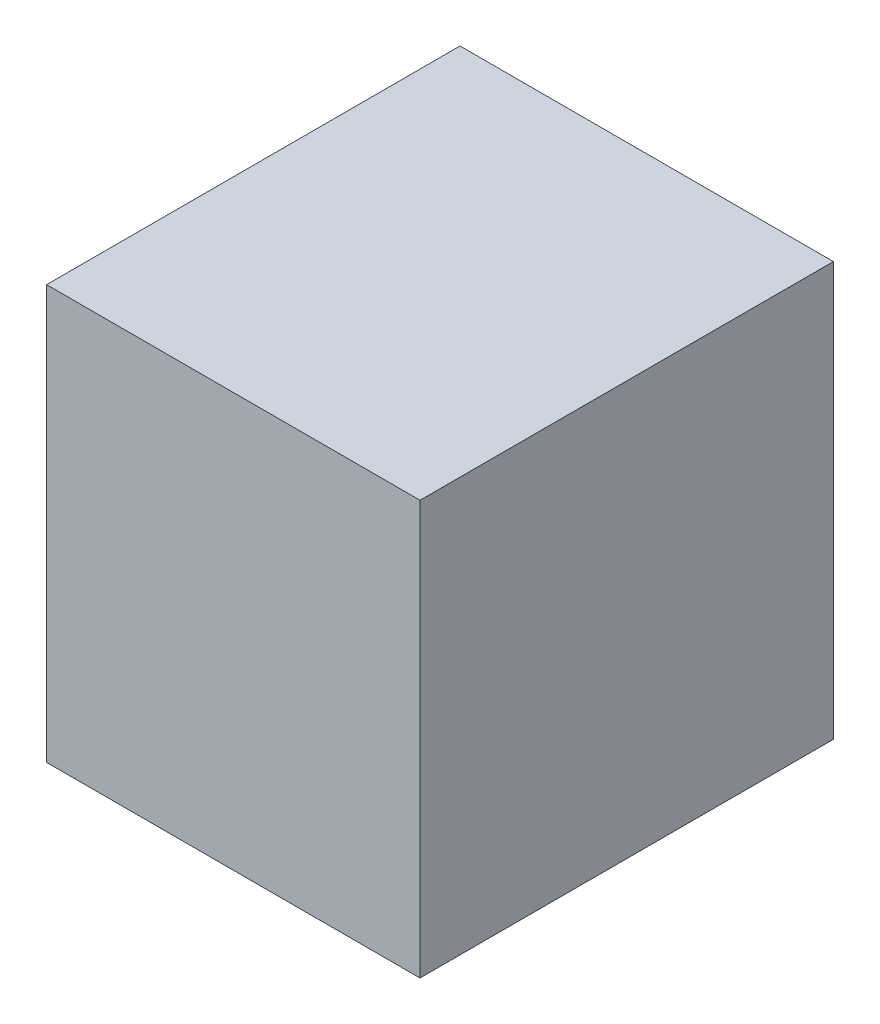
ISO-10303-21;
HEADER;
FILE_DESCRIPTION(('STEP AP214'),'2;1');
FILE_NAME('part.step','',(''),(''),'','','');
FILE_SCHEMA(('AUTOMOTIVE_DESIGN { 1 0 10303 214 1 1 1 1 }'));
ENDSEC;
DATA;
#1=APPLICATION_CONTEXT('core data for automotive mechanical design processes');
#2=APPLICATION_PROTOCOL_DEFINITION('international standard','automotive_design',2000,#1);
#3=PRODUCT_CONTEXT('',#1,'mechanical');
#4=PRODUCT('Part','Part','',(#3));
#5=PRODUCT_RELATED_PRODUCT_CATEGORY('part','',(#4));
#6=PRODUCT_DEFINITION_FORMATION('','',#4);
#7=PRODUCT_DEFINITION_CONTEXT('part definition',#1,'design');
#8=PRODUCT_DEFINITION('design','',#6,#7);
#9=PRODUCT_DEFINITION_SHAPE('','',#8);
#10=(LENGTH_UNIT() NAMED_UNIT(*) SI_UNIT(.MILLI.,.METRE.));
#11=(NAMED_UNIT(*) PLANE_ANGLE_UNIT() SI_UNIT($,.RADIAN.));
#12=(NAMED_UNIT(*) SI_UNIT($,.STERADIAN.) SOLID_ANGLE_UNIT());
#13=UNCERTAINTY_MEASURE_WITH_UNIT(LENGTH_MEASURE(1.E-05),#10,'distance_accuracy_value','');
#14=(GEOMETRIC_REPRESENTATION_CONTEXT(3) GLOBAL_UNCERTAINTY_ASSIGNED_CONTEXT((#13)) GLOBAL_UNIT_ASSIGNED_CONTEXT((#10,
#11,#12)) REPRESENTATION_CONTEXT('',''));
#15=CARTESIAN_POINT('',(0.,0.,0.));
#16=DIRECTION('',(0.,0.,1.));
#17=DIRECTION('',(1.,0.,0.));
#18=AXIS2_PLACEMENT_3D('',#15,#16,#17);
#19=CARTESIAN_POINT('',(0.546,-0.605,0.018));
#20=DIRECTION('',(1.,0.,0.));
#21=DIRECTION('',(0.,0.,-1.));
#22=AXIS2_PLACEMENT_3D('',#19,#20,#21);
#23=PLANE('',#22);
#24=DIRECTION('',(0.,1.,0.));
#25=VECTOR('',#24,1.);
#26=CARTESIAN_POINT('',(0.546,-0.605,1.227));
#27=LINE('',#26,#25);
#28=CARTESIAN_POINT('',(0.546,-0.605,1.227));
#29=VERTEX_POINT('',#28);
#30=CARTESIAN_POINT('',(0.546,0.605,1.227));
#31=VERTEX_POINT('',#30);
#32=EDGE_CURVE('E68',#29,#31,#27,.T.);
#33=ORIENTED_EDGE('',*,*,#32,.F.);
#34=DIRECTION('',(0.,0.,-1.));
#35=VECTOR('',#34,1.);
#36=CARTESIAN_POINT('',(0.546,-0.605,0.018));
#37=LINE('',#36,#35);
#38=CARTESIAN_POINT('',(0.546,-0.605,0.018));
#39=VERTEX_POINT('',#38);
#40=EDGE_CURVE('E55',#39,#29,#37,.F.);
#41=ORIENTED_EDGE('',*,*,#40,.F.);
#42=DIRECTION('',(0.,1.,0.));
#43=VECTOR('',#42,1.);
#44=CARTESIAN_POINT('',(0.546,0.605,0.018));
#45=LINE('',#44,#43);
#46=CARTESIAN_POINT('',(0.546,0.605,0.018));
#47=VERTEX_POINT('',#46);
#48=EDGE_CURVE('E20',#47,#39,#45,.F.);
#49=ORIENTED_EDGE('',*,*,#48,.F.);
#50=DIRECTION('',(0.,0.,1.));
#51=VECTOR('',#50,1.);
#52=CARTESIAN_POINT('',(0.546,0.605,0.018));
#53=LINE('',#52,#51);
#54=EDGE_CURVE('E81',#31,#47,#53,.F.);
#55=ORIENTED_EDGE('',*,*,#54,.F.);
#56=EDGE_LOOP('',(#33,#41,#49,#55));
#57=FACE_BOUND('',#56,.T.);
#58=ADVANCED_FACE('F17',(#57),#23,.T.);
#59=CARTESIAN_POINT('',(-0.546,0.605,0.018));
#60=DIRECTION('',(0.,0.,-1.));
#61=DIRECTION('',(-1.,0.,0.));
#62=AXIS2_PLACEMENT_3D('',#59,#60,#61);
#63=PLANE('',#62);
#64=DIRECTION('',(1.,0.,0.));
#65=VECTOR('',#64,1.);
#66=CARTESIAN_POINT('',(-0.546,-0.605,0.018));
#67=LINE('',#66,#65);
#68=CARTESIAN_POINT('',(-0.546,-0.605,0.018));
#69=VERTEX_POINT('',#68);
#70=EDGE_CURVE('E61',#69,#39,#67,.T.);
#71=ORIENTED_EDGE('',*,*,#70,.F.);
#72=DIRECTION('',(0.,1.,0.));
#73=VECTOR('',#72,1.);
#74=CARTESIAN_POINT('',(-0.546,0.605,0.018));
#75=LINE('',#74,#73);
#76=CARTESIAN_POINT('',(-0.546,0.605,0.018));
#77=VERTEX_POINT('',#76);
#78=EDGE_CURVE('E83',#77,#69,#75,.F.);
#79=ORIENTED_EDGE('',*,*,#78,.F.);
#80=DIRECTION('',(1.,0.,0.));
#81=VECTOR('',#80,1.);
#82=CARTESIAN_POINT('',(0.546,0.605,0.018));
#83=LINE('',#82,#81);
#84=EDGE_CURVE('E64',#47,#77,#83,.F.);
#85=ORIENTED_EDGE('',*,*,#84,.F.);
#86=ORIENTED_EDGE('',*,*,#48,.T.);
#87=EDGE_LOOP('',(#71,#79,#85,#86));
#88=FACE_BOUND('',#87,.T.);
#89=ADVANCED_FACE('F60',(#88),#63,.T.);
#90=CARTESIAN_POINT('',(-0.546,-0.605,0.018));
#91=DIRECTION('',(0.,-1.,0.));
#92=DIRECTION('',(0.,0.,-1.));
#93=AXIS2_PLACEMENT_3D('',#90,#91,#92);
#94=PLANE('',#93);
#95=DIRECTION('',(1.,0.,0.));
#96=VECTOR('',#95,1.);
#97=CARTESIAN_POINT('',(-0.546,-0.605,1.227));
#98=LINE('',#97,#96);
#99=CARTESIAN_POINT('',(-0.546,-0.605,1.227));
#100=VERTEX_POINT('',#99);
#101=EDGE_CURVE('E70',#100,#29,#98,.T.);
#102=ORIENTED_EDGE('',*,*,#101,.F.);
#103=DIRECTION('',(0.,0.,1.));
#104=VECTOR('',#103,1.);
#105=CARTESIAN_POINT('',(-0.546,-0.605,0.018));
#106=LINE('',#105,#104);
#107=EDGE_CURVE('E74',#69,#100,#106,.T.);
#108=ORIENTED_EDGE('',*,*,#107,.F.);
#109=ORIENTED_EDGE('',*,*,#70,.T.);
#110=ORIENTED_EDGE('',*,*,#40,.T.);
#111=EDGE_LOOP('',(#102,#108,#109,#110));
#112=FACE_BOUND('',#111,.T.);
#113=ADVANCED_FACE('F72',(#112),#94,.T.);
#114=CARTESIAN_POINT('',(-0.546,-0.605,1.227));
#115=DIRECTION('',(0.,0.,1.));
#116=DIRECTION('',(1.,0.,0.));
#117=AXIS2_PLACEMENT_3D('',#114,#115,#116);
#118=PLANE('',#117);
#119=DIRECTION('',(1.,0.,0.));
#120=VECTOR('',#119,1.);
#121=CARTESIAN_POINT('',(0.546,0.605,1.227));
#122=LINE('',#121,#120);
#123=CARTESIAN_POINT('',(-0.546,0.605,1.227));
#124=VERTEX_POINT('',#123);
#125=EDGE_CURVE('E35',#124,#31,#122,.T.);
#126=ORIENTED_EDGE('',*,*,#125,.F.);
#127=DIRECTION('',(0.,1.,0.));
#128=VECTOR('',#127,1.);
#129=CARTESIAN_POINT('',(-0.546,0.605,1.227));
#130=LINE('',#129,#128);
#131=EDGE_CURVE('E26',#100,#124,#130,.T.);
#132=ORIENTED_EDGE('',*,*,#131,.F.);
#133=ORIENTED_EDGE('',*,*,#101,.T.);
#134=ORIENTED_EDGE('',*,*,#32,.T.);
#135=EDGE_LOOP('',(#126,#132,#133,#134));
#136=FACE_BOUND('',#135,.T.);
#137=ADVANCED_FACE('F89',(#136),#118,.T.);
#138=CARTESIAN_POINT('',(0.546,0.605,0.018));
#139=DIRECTION('',(0.,1.,0.));
#140=DIRECTION('',(0.,0.,1.));
#141=AXIS2_PLACEMENT_3D('',#138,#139,#140);
#142=PLANE('',#141);
#143=ORIENTED_EDGE('',*,*,#125,.T.);
#144=ORIENTED_EDGE('',*,*,#54,.T.);
#145=ORIENTED_EDGE('',*,*,#84,.T.);
#146=DIRECTION('',(0.,0.,1.));
#147=VECTOR('',#146,1.);
#148=CARTESIAN_POINT('',(-0.546,0.605,0.018));
#149=LINE('',#148,#147);
#150=EDGE_CURVE('E11',#124,#77,#149,.F.);
#151=ORIENTED_EDGE('',*,*,#150,.F.);
#152=EDGE_LOOP('',(#143,#144,#145,#151));
#153=FACE_BOUND('',#152,.T.);
#154=ADVANCED_FACE('F91',(#153),#142,.T.);
#155=CARTESIAN_POINT('',(-0.546,0.605,0.018));
#156=DIRECTION('',(-1.,0.,0.));
#157=DIRECTION('',(0.,0.,1.));
#158=AXIS2_PLACEMENT_3D('',#155,#156,#157);
#159=PLANE('',#158);
#160=ORIENTED_EDGE('',*,*,#131,.T.);
#161=ORIENTED_EDGE('',*,*,#150,.T.);
#162=ORIENTED_EDGE('',*,*,#78,.T.);
#163=ORIENTED_EDGE('',*,*,#107,.T.);
#164=EDGE_LOOP('',(#160,#161,#162,#163));
#165=FACE_BOUND('',#164,.T.);
#166=ADVANCED_FACE('F88',(#165),#159,.T.);
#167=CLOSED_SHELL('',(#58,#89,#113,#137,#154,#166));
#168=MANIFOLD_SOLID_BREP('B1',#167);
#169=ADVANCED_BREP_SHAPE_REPRESENTATION('',(#18,#168),#14);
#170=SHAPE_DEFINITION_REPRESENTATION(#9,#169);
ENDSEC;
END-ISO-10303-21;
